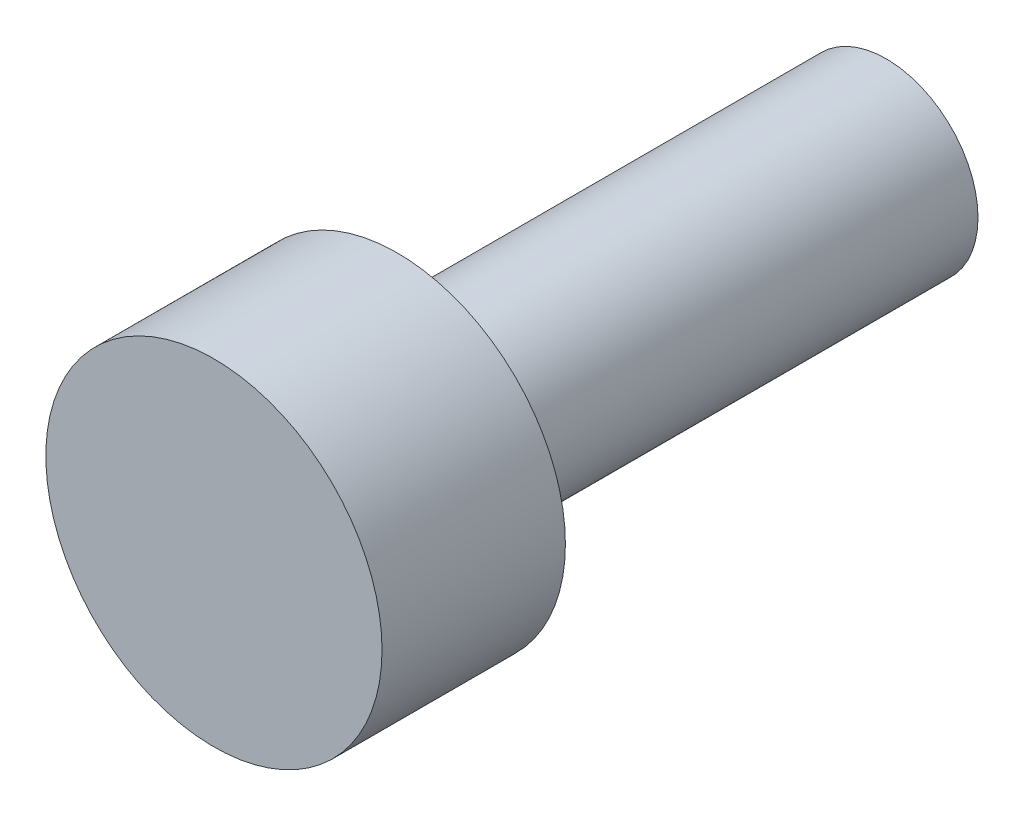
ISO-10303-21;
HEADER;
FILE_DESCRIPTION(('STEP AP214'),'2;1');
FILE_NAME('part.step','',(''),(''),'','','');
FILE_SCHEMA(('AUTOMOTIVE_DESIGN { 1 0 10303 214 1 1 1 1 }'));
ENDSEC;
DATA;
#1=APPLICATION_CONTEXT('core data for automotive mechanical design processes');
#2=APPLICATION_PROTOCOL_DEFINITION('international standard','automotive_design',2000,#1);
#3=PRODUCT_CONTEXT('',#1,'mechanical');
#4=PRODUCT('Part','Part','',(#3));
#5=PRODUCT_RELATED_PRODUCT_CATEGORY('part','',(#4));
#6=PRODUCT_DEFINITION_FORMATION('','',#4);
#7=PRODUCT_DEFINITION_CONTEXT('part definition',#1,'design');
#8=PRODUCT_DEFINITION('design','',#6,#7);
#9=PRODUCT_DEFINITION_SHAPE('','',#8);
#10=(LENGTH_UNIT() NAMED_UNIT(*) SI_UNIT(.MILLI.,.METRE.));
#11=(NAMED_UNIT(*) PLANE_ANGLE_UNIT() SI_UNIT($,.RADIAN.));
#12=(NAMED_UNIT(*) SI_UNIT($,.STERADIAN.) SOLID_ANGLE_UNIT());
#13=UNCERTAINTY_MEASURE_WITH_UNIT(LENGTH_MEASURE(1.E-05),#10,'distance_accuracy_value','');
#14=(GEOMETRIC_REPRESENTATION_CONTEXT(3) GLOBAL_UNCERTAINTY_ASSIGNED_CONTEXT((#13)) GLOBAL_UNIT_ASSIGNED_CONTEXT((#10,
#11,#12)) REPRESENTATION_CONTEXT('',''));
#15=CARTESIAN_POINT('',(0.,0.,0.));
#16=DIRECTION('',(0.,0.,1.));
#17=DIRECTION('',(1.,0.,0.));
#18=AXIS2_PLACEMENT_3D('',#15,#16,#17);
#19=CARTESIAN_POINT('',(0.,0.,0.));
#20=DIRECTION('',(0.,0.,-1.));
#21=DIRECTION('',(-1.,0.,0.));
#22=AXIS2_PLACEMENT_3D('',#19,#20,#21);
#23=CYLINDRICAL_SURFACE('',#22,1.5);
#24=CARTESIAN_POINT('',(0.,0.,0.));
#25=DIRECTION('',(0.,0.,1.));
#26=DIRECTION('',(1.,0.,0.));
#27=AXIS2_PLACEMENT_3D('',#24,#25,#26);
#28=CIRCLE('',#27,1.5);
#29=CARTESIAN_POINT('',(1.5,0.,0.));
#30=VERTEX_POINT('',#29);
#31=EDGE_CURVE('E10',#30,#30,#28,.T.);
#32=ORIENTED_EDGE('',*,*,#31,.F.);
#33=EDGE_LOOP('',(#32));
#34=FACE_BOUND('',#33,.T.);
#35=CARTESIAN_POINT('',(0.,0.,-8.));
#36=DIRECTION('',(0.,0.,1.));
#37=DIRECTION('',(1.,0.,0.));
#38=AXIS2_PLACEMENT_3D('',#35,#36,#37);
#39=CIRCLE('',#38,1.5);
#40=CARTESIAN_POINT('',(1.5,0.,-8.));
#41=VERTEX_POINT('',#40);
#42=EDGE_CURVE('E44',#41,#41,#39,.T.);
#43=ORIENTED_EDGE('',*,*,#42,.T.);
#44=EDGE_LOOP('',(#43));
#45=FACE_BOUND('',#44,.T.);
#46=ADVANCED_FACE('F41',(#34,#45),#23,.T.);
#47=CARTESIAN_POINT('',(0.,0.,-8.));
#48=DIRECTION('',(0.,0.,1.));
#49=DIRECTION('',(1.,0.,0.));
#50=AXIS2_PLACEMENT_3D('',#47,#48,#49);
#51=PLANE('',#50);
#52=ORIENTED_EDGE('',*,*,#42,.F.);
#53=EDGE_LOOP('',(#52));
#54=FACE_BOUND('',#53,.T.);
#55=ADVANCED_FACE('F64',(#54),#51,.F.);
#56=CARTESIAN_POINT('',(0.,0.,3.));
#57=DIRECTION('',(0.,0.,-1.));
#58=DIRECTION('',(-1.,0.,0.));
#59=AXIS2_PLACEMENT_3D('',#56,#57,#58);
#60=CYLINDRICAL_SURFACE('',#59,2.75);
#61=CARTESIAN_POINT('',(0.,0.,3.));
#62=DIRECTION('',(0.,0.,1.));
#63=DIRECTION('',(1.,0.,0.));
#64=AXIS2_PLACEMENT_3D('',#61,#62,#63);
#65=CIRCLE('',#64,2.75);
#66=CARTESIAN_POINT('',(2.75,0.,3.));
#67=VERTEX_POINT('',#66);
#68=EDGE_CURVE('E51',#67,#67,#65,.T.);
#69=ORIENTED_EDGE('',*,*,#68,.F.);
#70=EDGE_LOOP('',(#69));
#71=FACE_BOUND('',#70,.T.);
#72=CARTESIAN_POINT('',(0.,0.,0.));
#73=DIRECTION('',(0.,0.,1.));
#74=DIRECTION('',(1.,0.,0.));
#75=AXIS2_PLACEMENT_3D('',#72,#73,#74);
#76=CIRCLE('',#75,2.75);
#77=CARTESIAN_POINT('',(2.75,0.,0.));
#78=VERTEX_POINT('',#77);
#79=EDGE_CURVE('E53',#78,#78,#76,.T.);
#80=ORIENTED_EDGE('',*,*,#79,.T.);
#81=EDGE_LOOP('',(#80));
#82=FACE_BOUND('',#81,.T.);
#83=ADVANCED_FACE('F61',(#71,#82),#60,.T.);
#84=CARTESIAN_POINT('',(0.,0.,3.));
#85=DIRECTION('',(0.,0.,1.));
#86=DIRECTION('',(1.,0.,0.));
#87=AXIS2_PLACEMENT_3D('',#84,#85,#86);
#88=PLANE('',#87);
#89=ORIENTED_EDGE('',*,*,#68,.T.);
#90=EDGE_LOOP('',(#89));
#91=FACE_BOUND('',#90,.T.);
#92=ADVANCED_FACE('F59',(#91),#88,.T.);
#93=CARTESIAN_POINT('',(0.,0.,0.));
#94=DIRECTION('',(0.,0.,1.));
#95=DIRECTION('',(1.,0.,0.));
#96=AXIS2_PLACEMENT_3D('',#93,#94,#95);
#97=PLANE('',#96);
#98=ORIENTED_EDGE('',*,*,#31,.T.);
#99=EDGE_LOOP('',(#98));
#100=FACE_BOUND('',#99,.T.);
#101=ORIENTED_EDGE('',*,*,#79,.F.);
#102=EDGE_LOOP('',(#101));
#103=FACE_BOUND('',#102,.T.);
#104=ADVANCED_FACE('F68',(#100,#103),#97,.F.);
#105=CLOSED_SHELL('',(#46,#55,#83,#92,#104));
#106=MANIFOLD_SOLID_BREP('B2',#105);
#107=ADVANCED_BREP_SHAPE_REPRESENTATION('',(#18,#106),#14);
#108=SHAPE_DEFINITION_REPRESENTATION(#9,#107);
ENDSEC;
END-ISO-10303-21;
